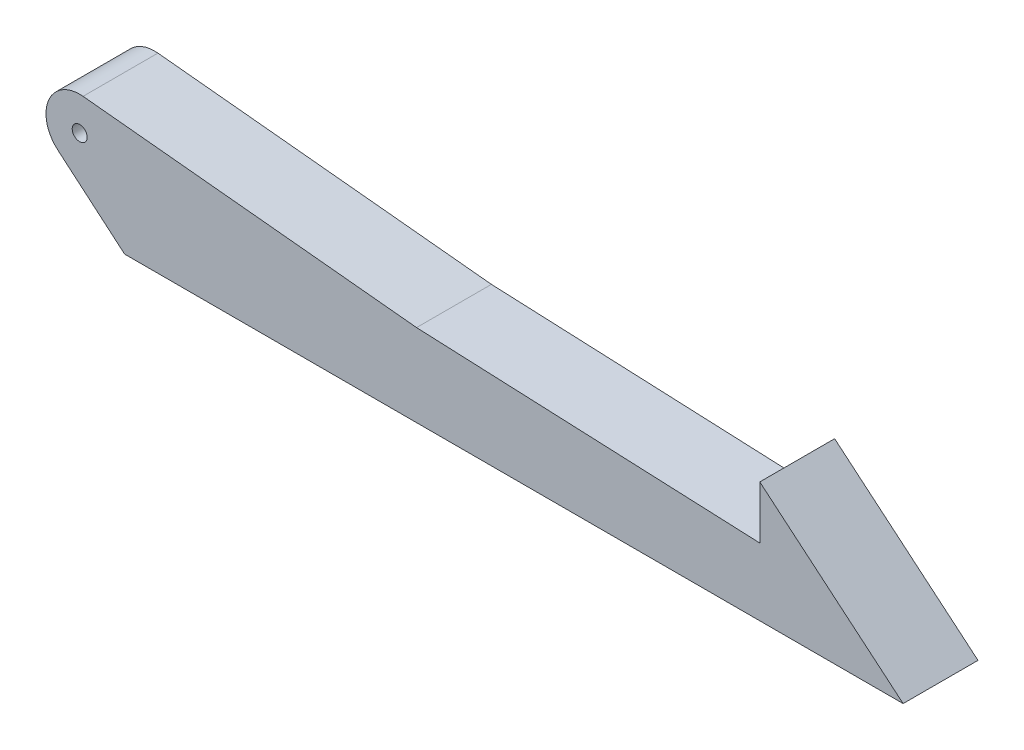
ISO-10303-21;
HEADER;
FILE_DESCRIPTION(('STEP AP214'),'2;1');
FILE_NAME('part.step','',(''),(''),'','','');
FILE_SCHEMA(('AUTOMOTIVE_DESIGN { 1 0 10303 214 1 1 1 1 }'));
ENDSEC;
DATA;
#1=APPLICATION_CONTEXT('core data for automotive mechanical design processes');
#2=APPLICATION_PROTOCOL_DEFINITION('international standard','automotive_design',2000,#1);
#3=PRODUCT_CONTEXT('',#1,'mechanical');
#4=PRODUCT('Part','Part','',(#3));
#5=PRODUCT_RELATED_PRODUCT_CATEGORY('part','',(#4));
#6=PRODUCT_DEFINITION_FORMATION('','',#4);
#7=PRODUCT_DEFINITION_CONTEXT('part definition',#1,'design');
#8=PRODUCT_DEFINITION('design','',#6,#7);
#9=PRODUCT_DEFINITION_SHAPE('','',#8);
#10=(LENGTH_UNIT() NAMED_UNIT(*) SI_UNIT(.MILLI.,.METRE.));
#11=(NAMED_UNIT(*) PLANE_ANGLE_UNIT() SI_UNIT($,.RADIAN.));
#12=(NAMED_UNIT(*) SI_UNIT($,.STERADIAN.) SOLID_ANGLE_UNIT());
#13=UNCERTAINTY_MEASURE_WITH_UNIT(LENGTH_MEASURE(1.E-05),#10,'distance_accuracy_value','');
#14=(GEOMETRIC_REPRESENTATION_CONTEXT(3) GLOBAL_UNCERTAINTY_ASSIGNED_CONTEXT((#13)) GLOBAL_UNIT_ASSIGNED_CONTEXT((#10,
#11,#12)) REPRESENTATION_CONTEXT('',''));
#15=CARTESIAN_POINT('',(0.,0.,0.));
#16=DIRECTION('',(0.,0.,1.));
#17=DIRECTION('',(1.,0.,0.));
#18=AXIS2_PLACEMENT_3D('',#15,#16,#17);
#19=CARTESIAN_POINT('',(0.,0.,10.));
#20=DIRECTION('',(0.,0.,1.));
#21=DIRECTION('',(1.,0.,0.));
#22=AXIS2_PLACEMENT_3D('',#19,#20,#21);
#23=PLANE('',#22);
#24=DIRECTION('',(0.762191677587,-0.6473514089095,0.));
#25=VECTOR('',#24,1.);
#26=CARTESIAN_POINT('',(6.,-11.,10.));
#27=LINE('',#26,#25);
#28=CARTESIAN_POINT('',(-2.91308134009275,-3.4298625491415,10.));
#29=VERTEX_POINT('',#28);
#30=CARTESIAN_POINT('',(6.,-11.,10.));
#31=VERTEX_POINT('',#30);
#32=EDGE_CURVE('E161',#29,#31,#27,.T.);
#33=ORIENTED_EDGE('',*,*,#32,.T.);
#34=DIRECTION('',(1.,0.,0.));
#35=VECTOR('',#34,1.);
#36=CARTESIAN_POINT('',(6.,-11.,10.));
#37=LINE('',#36,#35);
#38=CARTESIAN_POINT('',(110.,-11.,10.));
#39=VERTEX_POINT('',#38);
#40=EDGE_CURVE('E103',#31,#39,#37,.T.);
#41=ORIENTED_EDGE('',*,*,#40,.T.);
#42=DIRECTION('',(-0.766044443118982,0.642787609686535,0.));
#43=VECTOR('',#42,1.);
#44=CARTESIAN_POINT('',(110.,-11.,10.));
#45=LINE('',#44,#43);
#46=CARTESIAN_POINT('',(90.8488889220255,5.06969024216337,10.));
#47=VERTEX_POINT('',#46);
#48=EDGE_CURVE('E178',#39,#47,#45,.T.);
#49=ORIENTED_EDGE('',*,*,#48,.T.);
#50=DIRECTION('',(0.,-1.,0.));
#51=VECTOR('',#50,1.);
#52=CARTESIAN_POINT('',(90.8488889220255,5.06969024216337,10.));
#53=LINE('',#52,#51);
#54=CARTESIAN_POINT('',(90.8488889220255,-2.,10.));
#55=VERTEX_POINT('',#54);
#56=EDGE_CURVE('E119',#47,#55,#53,.T.);
#57=ORIENTED_EDGE('',*,*,#56,.T.);
#58=DIRECTION('',(-0.999049935458847,0.0435801154160101,0.));
#59=VECTOR('',#58,1.);
#60=CARTESIAN_POINT('',(45.,0.,10.));
#61=LINE('',#60,#59);
#62=CARTESIAN_POINT('',(45.,0.,10.));
#63=VERTEX_POINT('',#62);
#64=EDGE_CURVE('E113',#55,#63,#61,.T.);
#65=ORIENTED_EDGE('',*,*,#64,.T.);
#66=DIRECTION('',(-0.99498743710662,0.1,0.));
#67=VECTOR('',#66,1.);
#68=CARTESIAN_POINT('',(0.45,4.47744346697979,10.));
#69=LINE('',#68,#67);
#70=CARTESIAN_POINT('',(0.45,4.47744346697979,10.));
#71=VERTEX_POINT('',#70);
#72=EDGE_CURVE('E117',#63,#71,#69,.T.);
#73=ORIENTED_EDGE('',*,*,#72,.T.);
#74=CARTESIAN_POINT('',(0.,0.,10.));
#75=DIRECTION('',(0.,0.,1.));
#76=DIRECTION('',(1.,0.,0.));
#77=AXIS2_PLACEMENT_3D('',#74,#75,#76);
#78=CIRCLE('',#77,4.5);
#79=EDGE_CURVE('E63',#71,#29,#78,.T.);
#80=ORIENTED_EDGE('',*,*,#79,.T.);
#81=EDGE_LOOP('',(#33,#41,#49,#57,#65,#73,#80));
#82=FACE_BOUND('',#81,.T.);
#83=CARTESIAN_POINT('',(0.,0.,10.));
#84=DIRECTION('',(0.,0.,1.));
#85=DIRECTION('',(1.,0.,0.));
#86=AXIS2_PLACEMENT_3D('',#83,#84,#85);
#87=CIRCLE('',#86,1.);
#88=CARTESIAN_POINT('',(1.,0.,10.));
#89=VERTEX_POINT('',#88);
#90=EDGE_CURVE('E146',#89,#89,#87,.T.);
#91=ORIENTED_EDGE('',*,*,#90,.F.);
#92=EDGE_LOOP('',(#91));
#93=FACE_BOUND('',#92,.T.);
#94=ADVANCED_FACE('F45',(#82,#93),#23,.T.);
#95=CARTESIAN_POINT('',(0.,0.,0.));
#96=DIRECTION('',(0.,0.,1.));
#97=DIRECTION('',(1.,0.,0.));
#98=AXIS2_PLACEMENT_3D('',#95,#96,#97);
#99=PLANE('',#98);
#100=DIRECTION('',(0.762191677587,-0.6473514089095,0.));
#101=VECTOR('',#100,1.);
#102=CARTESIAN_POINT('',(6.,-11.,0.));
#103=LINE('',#102,#101);
#104=CARTESIAN_POINT('',(-2.91308134009275,-3.4298625491415,0.));
#105=VERTEX_POINT('',#104);
#106=CARTESIAN_POINT('',(6.,-11.,0.));
#107=VERTEX_POINT('',#106);
#108=EDGE_CURVE('E141',#105,#107,#103,.T.);
#109=ORIENTED_EDGE('',*,*,#108,.F.);
#110=CARTESIAN_POINT('',(0.,0.,0.));
#111=DIRECTION('',(0.,0.,1.));
#112=DIRECTION('',(1.,0.,0.));
#113=AXIS2_PLACEMENT_3D('',#110,#111,#112);
#114=CIRCLE('',#113,4.5);
#115=CARTESIAN_POINT('',(0.45,4.47744346697979,0.));
#116=VERTEX_POINT('',#115);
#117=EDGE_CURVE('E95',#116,#105,#114,.T.);
#118=ORIENTED_EDGE('',*,*,#117,.F.);
#119=DIRECTION('',(-0.99498743710662,0.1,0.));
#120=VECTOR('',#119,1.);
#121=CARTESIAN_POINT('',(0.45,4.47744346697979,0.));
#122=LINE('',#121,#120);
#123=CARTESIAN_POINT('',(45.,0.,0.));
#124=VERTEX_POINT('',#123);
#125=EDGE_CURVE('E89',#124,#116,#122,.T.);
#126=ORIENTED_EDGE('',*,*,#125,.F.);
#127=DIRECTION('',(-0.999049935458847,0.0435801154160101,0.));
#128=VECTOR('',#127,1.);
#129=CARTESIAN_POINT('',(45.,0.,0.));
#130=LINE('',#129,#128);
#131=CARTESIAN_POINT('',(90.8488889220255,-2.,0.));
#132=VERTEX_POINT('',#131);
#133=EDGE_CURVE('E128',#132,#124,#130,.T.);
#134=ORIENTED_EDGE('',*,*,#133,.F.);
#135=DIRECTION('',(0.,-1.,0.));
#136=VECTOR('',#135,1.);
#137=CARTESIAN_POINT('',(90.8488889220255,5.06969024216337,0.));
#138=LINE('',#137,#136);
#139=CARTESIAN_POINT('',(90.8488889220255,5.06969024216337,0.));
#140=VERTEX_POINT('',#139);
#141=EDGE_CURVE('E152',#140,#132,#138,.T.);
#142=ORIENTED_EDGE('',*,*,#141,.F.);
#143=DIRECTION('',(-0.766044443118982,0.642787609686535,0.));
#144=VECTOR('',#143,1.);
#145=CARTESIAN_POINT('',(110.,-11.,0.));
#146=LINE('',#145,#144);
#147=CARTESIAN_POINT('',(110.,-11.,0.));
#148=VERTEX_POINT('',#147);
#149=EDGE_CURVE('E149',#148,#140,#146,.T.);
#150=ORIENTED_EDGE('',*,*,#149,.F.);
#151=DIRECTION('',(1.,0.,0.));
#152=VECTOR('',#151,1.);
#153=CARTESIAN_POINT('',(6.,-11.,0.));
#154=LINE('',#153,#152);
#155=EDGE_CURVE('E145',#107,#148,#154,.T.);
#156=ORIENTED_EDGE('',*,*,#155,.F.);
#157=EDGE_LOOP('',(#109,#118,#126,#134,#142,#150,#156));
#158=FACE_BOUND('',#157,.T.);
#159=CARTESIAN_POINT('',(0.,0.,0.));
#160=DIRECTION('',(0.,0.,1.));
#161=DIRECTION('',(1.,0.,0.));
#162=AXIS2_PLACEMENT_3D('',#159,#160,#161);
#163=CIRCLE('',#162,1.);
#164=CARTESIAN_POINT('',(1.,0.,0.));
#165=VERTEX_POINT('',#164);
#166=EDGE_CURVE('E194',#165,#165,#163,.T.);
#167=ORIENTED_EDGE('',*,*,#166,.T.);
#168=EDGE_LOOP('',(#167));
#169=FACE_BOUND('',#168,.T.);
#170=ADVANCED_FACE('F182',(#158,#169),#99,.F.);
#171=CARTESIAN_POINT('',(6.,-11.,10.));
#172=DIRECTION('',(0.6473514089095,0.762191677587,0.));
#173=DIRECTION('',(-0.762191677587,0.6473514089095,0.));
#174=AXIS2_PLACEMENT_3D('',#171,#172,#173);
#175=PLANE('',#174);
#176=ORIENTED_EDGE('',*,*,#108,.T.);
#177=DIRECTION('',(0.,0.,-1.));
#178=VECTOR('',#177,1.);
#179=CARTESIAN_POINT('',(6.,-11.,10.));
#180=LINE('',#179,#178);
#181=EDGE_CURVE('E11',#31,#107,#180,.T.);
#182=ORIENTED_EDGE('',*,*,#181,.F.);
#183=ORIENTED_EDGE('',*,*,#32,.F.);
#184=DIRECTION('',(0.,0.,-1.));
#185=VECTOR('',#184,1.);
#186=CARTESIAN_POINT('',(-2.91308134009275,-3.4298625491415,10.));
#187=LINE('',#186,#185);
#188=EDGE_CURVE('E137',#29,#105,#187,.T.);
#189=ORIENTED_EDGE('',*,*,#188,.T.);
#190=EDGE_LOOP('',(#176,#182,#183,#189));
#191=FACE_BOUND('',#190,.T.);
#192=ADVANCED_FACE('F47',(#191),#175,.F.);
#193=CARTESIAN_POINT('',(6.,-11.,10.));
#194=DIRECTION('',(0.,1.,0.));
#195=DIRECTION('',(0.,0.,1.));
#196=AXIS2_PLACEMENT_3D('',#193,#194,#195);
#197=PLANE('',#196);
#198=ORIENTED_EDGE('',*,*,#155,.T.);
#199=DIRECTION('',(0.,0.,-1.));
#200=VECTOR('',#199,1.);
#201=CARTESIAN_POINT('',(110.,-11.,10.));
#202=LINE('',#201,#200);
#203=EDGE_CURVE('E55',#39,#148,#202,.T.);
#204=ORIENTED_EDGE('',*,*,#203,.F.);
#205=ORIENTED_EDGE('',*,*,#40,.F.);
#206=ORIENTED_EDGE('',*,*,#181,.T.);
#207=EDGE_LOOP('',(#198,#204,#205,#206));
#208=FACE_BOUND('',#207,.T.);
#209=ADVANCED_FACE('F222',(#208),#197,.F.);
#210=CARTESIAN_POINT('',(110.,-11.,10.));
#211=DIRECTION('',(-0.642787609686535,-0.766044443118982,0.));
#212=DIRECTION('',(0.766044443118982,-0.642787609686535,0.));
#213=AXIS2_PLACEMENT_3D('',#210,#211,#212);
#214=PLANE('',#213);
#215=ORIENTED_EDGE('',*,*,#149,.T.);
#216=DIRECTION('',(0.,0.,-1.));
#217=VECTOR('',#216,1.);
#218=CARTESIAN_POINT('',(90.8488889220255,5.06969024216337,10.));
#219=LINE('',#218,#217);
#220=EDGE_CURVE('E168',#47,#140,#219,.T.);
#221=ORIENTED_EDGE('',*,*,#220,.F.);
#222=ORIENTED_EDGE('',*,*,#48,.F.);
#223=ORIENTED_EDGE('',*,*,#203,.T.);
#224=EDGE_LOOP('',(#215,#221,#222,#223));
#225=FACE_BOUND('',#224,.T.);
#226=ADVANCED_FACE('F176',(#225),#214,.F.);
#227=CARTESIAN_POINT('',(90.8488889220255,5.06969024216337,10.));
#228=DIRECTION('',(1.,0.,0.));
#229=DIRECTION('',(0.,0.,-1.));
#230=AXIS2_PLACEMENT_3D('',#227,#228,#229);
#231=PLANE('',#230);
#232=ORIENTED_EDGE('',*,*,#141,.T.);
#233=DIRECTION('',(0.,0.,-1.));
#234=VECTOR('',#233,1.);
#235=CARTESIAN_POINT('',(90.8488889220255,-2.,10.));
#236=LINE('',#235,#234);
#237=EDGE_CURVE('E130',#55,#132,#236,.T.);
#238=ORIENTED_EDGE('',*,*,#237,.F.);
#239=ORIENTED_EDGE('',*,*,#56,.F.);
#240=ORIENTED_EDGE('',*,*,#220,.T.);
#241=EDGE_LOOP('',(#232,#238,#239,#240));
#242=FACE_BOUND('',#241,.T.);
#243=ADVANCED_FACE('F185',(#242),#231,.F.);
#244=CARTESIAN_POINT('',(45.,0.,10.));
#245=DIRECTION('',(-0.0435801154160101,-0.999049935458847,0.));
#246=DIRECTION('',(0.999049935458847,-0.0435801154160101,0.));
#247=AXIS2_PLACEMENT_3D('',#244,#245,#246);
#248=PLANE('',#247);
#249=ORIENTED_EDGE('',*,*,#133,.T.);
#250=DIRECTION('',(0.,0.,-1.));
#251=VECTOR('',#250,1.);
#252=CARTESIAN_POINT('',(45.,0.,10.));
#253=LINE('',#252,#251);
#254=EDGE_CURVE('E125',#63,#124,#253,.T.);
#255=ORIENTED_EDGE('',*,*,#254,.F.);
#256=ORIENTED_EDGE('',*,*,#64,.F.);
#257=ORIENTED_EDGE('',*,*,#237,.T.);
#258=EDGE_LOOP('',(#249,#255,#256,#257));
#259=FACE_BOUND('',#258,.T.);
#260=ADVANCED_FACE('F126',(#259),#248,.F.);
#261=CARTESIAN_POINT('',(0.45,4.47744346697979,10.));
#262=DIRECTION('',(-0.1,-0.99498743710662,0.));
#263=DIRECTION('',(0.99498743710662,-0.1,0.));
#264=AXIS2_PLACEMENT_3D('',#261,#262,#263);
#265=PLANE('',#264);
#266=ORIENTED_EDGE('',*,*,#125,.T.);
#267=DIRECTION('',(0.,0.,-1.));
#268=VECTOR('',#267,1.);
#269=CARTESIAN_POINT('',(0.45,4.47744346697979,10.));
#270=LINE('',#269,#268);
#271=EDGE_CURVE('E131',#71,#116,#270,.T.);
#272=ORIENTED_EDGE('',*,*,#271,.F.);
#273=ORIENTED_EDGE('',*,*,#72,.F.);
#274=ORIENTED_EDGE('',*,*,#254,.T.);
#275=EDGE_LOOP('',(#266,#272,#273,#274));
#276=FACE_BOUND('',#275,.T.);
#277=ADVANCED_FACE('F133',(#276),#265,.F.);
#278=CARTESIAN_POINT('',(0.,0.,10.));
#279=DIRECTION('',(0.,0.,-1.));
#280=DIRECTION('',(-1.,0.,0.));
#281=AXIS2_PLACEMENT_3D('',#278,#279,#280);
#282=CYLINDRICAL_SURFACE('',#281,4.5);
#283=ORIENTED_EDGE('',*,*,#117,.T.);
#284=ORIENTED_EDGE('',*,*,#188,.F.);
#285=ORIENTED_EDGE('',*,*,#79,.F.);
#286=ORIENTED_EDGE('',*,*,#271,.T.);
#287=EDGE_LOOP('',(#283,#284,#285,#286));
#288=FACE_BOUND('',#287,.T.);
#289=ADVANCED_FACE('F212',(#288),#282,.T.);
#290=CARTESIAN_POINT('',(0.,0.,10.));
#291=DIRECTION('',(0.,0.,-1.));
#292=DIRECTION('',(-1.,0.,0.));
#293=AXIS2_PLACEMENT_3D('',#290,#291,#292);
#294=CYLINDRICAL_SURFACE('',#293,1.);
#295=ORIENTED_EDGE('',*,*,#90,.T.);
#296=EDGE_LOOP('',(#295));
#297=FACE_BOUND('',#296,.T.);
#298=ORIENTED_EDGE('',*,*,#166,.F.);
#299=EDGE_LOOP('',(#298));
#300=FACE_BOUND('',#299,.T.);
#301=ADVANCED_FACE('F202',(#297,#300),#294,.F.);
#302=CLOSED_SHELL('',(#94,#170,#192,#209,#226,#243,#260,#277,#289,#301));
#303=MANIFOLD_SOLID_BREP('B2',#302);
#304=ADVANCED_BREP_SHAPE_REPRESENTATION('',(#18,#303),#14);
#305=SHAPE_DEFINITION_REPRESENTATION(#9,#304);
ENDSEC;
END-ISO-10303-21;
